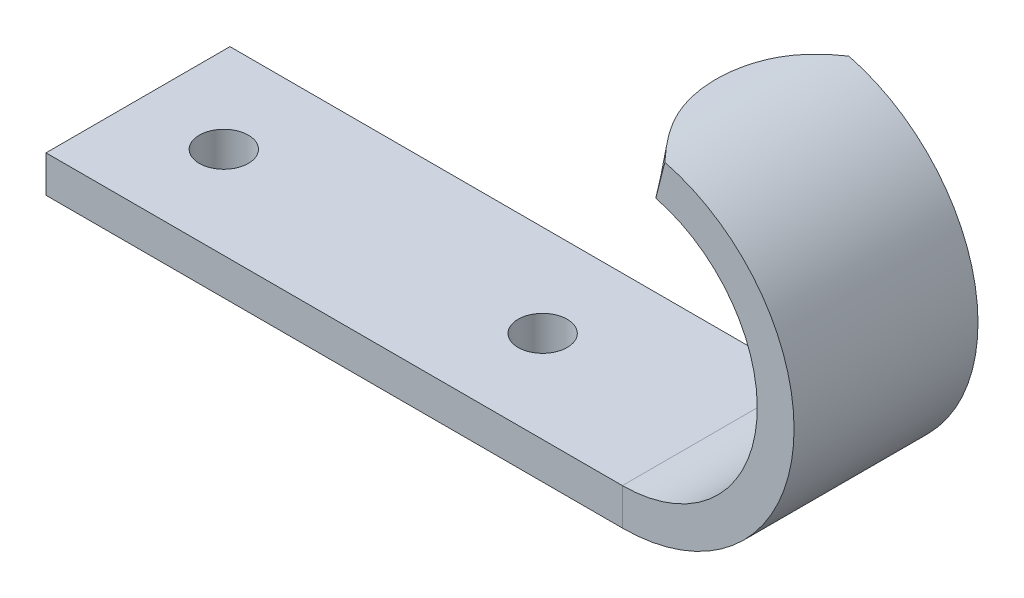
ISO-10303-21;
HEADER;
FILE_DESCRIPTION(('STEP AP214'),'2;1');
FILE_NAME('part.step','',(''),(''),'','','');
FILE_SCHEMA(('AUTOMOTIVE_DESIGN { 1 0 10303 214 1 1 1 1 }'));
ENDSEC;
DATA;
#1=APPLICATION_CONTEXT('core data for automotive mechanical design processes');
#2=APPLICATION_PROTOCOL_DEFINITION('international standard','automotive_design',2000,#1);
#3=PRODUCT_CONTEXT('',#1,'mechanical');
#4=PRODUCT('Part','Part','',(#3));
#5=PRODUCT_RELATED_PRODUCT_CATEGORY('part','',(#4));
#6=PRODUCT_DEFINITION_FORMATION('','',#4);
#7=PRODUCT_DEFINITION_CONTEXT('part definition',#1,'design');
#8=PRODUCT_DEFINITION('design','',#6,#7);
#9=PRODUCT_DEFINITION_SHAPE('','',#8);
#10=(LENGTH_UNIT() NAMED_UNIT(*) SI_UNIT(.MILLI.,.METRE.));
#11=(NAMED_UNIT(*) PLANE_ANGLE_UNIT() SI_UNIT($,.RADIAN.));
#12=(NAMED_UNIT(*) SI_UNIT($,.STERADIAN.) SOLID_ANGLE_UNIT());
#13=UNCERTAINTY_MEASURE_WITH_UNIT(LENGTH_MEASURE(1.E-05),#10,'distance_accuracy_value','');
#14=(GEOMETRIC_REPRESENTATION_CONTEXT(3) GLOBAL_UNCERTAINTY_ASSIGNED_CONTEXT((#13)) GLOBAL_UNIT_ASSIGNED_CONTEXT((#10,
#11,#12)) REPRESENTATION_CONTEXT('',''));
#15=CARTESIAN_POINT('',(0.,0.,0.));
#16=DIRECTION('',(0.,0.,1.));
#17=DIRECTION('',(1.,0.,0.));
#18=AXIS2_PLACEMENT_3D('',#15,#16,#17);
#19=CARTESIAN_POINT('',(-23.5,-3.,7.5));
#20=DIRECTION('',(-1.,0.,0.));
#21=DIRECTION('',(0.,0.,1.));
#22=AXIS2_PLACEMENT_3D('',#19,#20,#21);
#23=PLANE('',#22);
#24=DIRECTION('',(0.,1.,0.));
#25=VECTOR('',#24,1.);
#26=CARTESIAN_POINT('',(-23.5,-3.,-7.5));
#27=LINE('',#26,#25);
#28=CARTESIAN_POINT('',(-23.5,-3.,-7.5));
#29=VERTEX_POINT('',#28);
#30=CARTESIAN_POINT('',(-23.5,0.,-7.5));
#31=VERTEX_POINT('',#30);
#32=EDGE_CURVE('E374',#29,#31,#27,.T.);
#33=ORIENTED_EDGE('',*,*,#32,.F.);
#34=DIRECTION('',(0.,0.,-1.));
#35=VECTOR('',#34,1.);
#36=CARTESIAN_POINT('',(-23.5,-3.,7.5));
#37=LINE('',#36,#35);
#38=CARTESIAN_POINT('',(-23.5,-3.,7.5));
#39=VERTEX_POINT('',#38);
#40=EDGE_CURVE('E64',#39,#29,#37,.T.);
#41=ORIENTED_EDGE('',*,*,#40,.F.);
#42=DIRECTION('',(0.,1.,0.));
#43=VECTOR('',#42,1.);
#44=CARTESIAN_POINT('',(-23.5,-3.,7.5));
#45=LINE('',#44,#43);
#46=CARTESIAN_POINT('',(-23.5,0.,7.5));
#47=VERTEX_POINT('',#46);
#48=EDGE_CURVE('E128',#39,#47,#45,.T.);
#49=ORIENTED_EDGE('',*,*,#48,.T.);
#50=DIRECTION('',(0.,0.,-1.));
#51=VECTOR('',#50,1.);
#52=CARTESIAN_POINT('',(-23.5,0.,7.5));
#53=LINE('',#52,#51);
#54=EDGE_CURVE('E132',#47,#31,#53,.T.);
#55=ORIENTED_EDGE('',*,*,#54,.T.);
#56=EDGE_LOOP('',(#33,#41,#49,#55));
#57=FACE_BOUND('',#56,.T.);
#58=ADVANCED_FACE('F45',(#57),#23,.T.);
#59=CARTESIAN_POINT('',(-23.5,0.,7.5));
#60=DIRECTION('',(0.,1.,0.));
#61=DIRECTION('',(0.,0.,1.));
#62=AXIS2_PLACEMENT_3D('',#59,#60,#61);
#63=PLANE('',#62);
#64=CARTESIAN_POINT('',(-16.5,0.,0.));
#65=DIRECTION('',(0.,1.,0.));
#66=DIRECTION('',(0.,0.,1.));
#67=AXIS2_PLACEMENT_3D('',#64,#65,#66);
#68=CIRCLE('',#67,2.);
#69=CARTESIAN_POINT('',(-16.5,0.,2.));
#70=VERTEX_POINT('',#69);
#71=EDGE_CURVE('E224',#70,#70,#68,.T.);
#72=ORIENTED_EDGE('',*,*,#71,.F.);
#73=EDGE_LOOP('',(#72));
#74=FACE_BOUND('',#73,.T.);
#75=CARTESIAN_POINT('',(9.49999999999999,0.,0.));
#76=DIRECTION('',(0.,1.,0.));
#77=DIRECTION('',(0.,0.,1.));
#78=AXIS2_PLACEMENT_3D('',#75,#76,#77);
#79=CIRCLE('',#78,2.);
#80=CARTESIAN_POINT('',(9.49999999999999,0.,2.));
#81=VERTEX_POINT('',#80);
#82=EDGE_CURVE('E225',#81,#81,#79,.T.);
#83=ORIENTED_EDGE('',*,*,#82,.F.);
#84=EDGE_LOOP('',(#83));
#85=FACE_BOUND('',#84,.T.);
#86=DIRECTION('',(1.,0.,0.));
#87=VECTOR('',#86,1.);
#88=CARTESIAN_POINT('',(-23.5,0.,-7.5));
#89=LINE('',#88,#87);
#90=CARTESIAN_POINT('',(23.5,0.,-7.5));
#91=VERTEX_POINT('',#90);
#92=EDGE_CURVE('E369',#31,#91,#89,.T.);
#93=ORIENTED_EDGE('',*,*,#92,.F.);
#94=ORIENTED_EDGE('',*,*,#54,.F.);
#95=DIRECTION('',(1.,0.,0.));
#96=VECTOR('',#95,1.);
#97=CARTESIAN_POINT('',(-23.5,0.,7.5));
#98=LINE('',#97,#96);
#99=CARTESIAN_POINT('',(23.5,0.,7.5));
#100=VERTEX_POINT('',#99);
#101=EDGE_CURVE('E381',#47,#100,#98,.T.);
#102=ORIENTED_EDGE('',*,*,#101,.T.);
#103=DIRECTION('',(0.,0.,-1.));
#104=VECTOR('',#103,1.);
#105=CARTESIAN_POINT('',(23.5,0.,7.5));
#106=LINE('',#105,#104);
#107=EDGE_CURVE('E372',#100,#91,#106,.T.);
#108=ORIENTED_EDGE('',*,*,#107,.T.);
#109=EDGE_LOOP('',(#93,#94,#102,#108));
#110=FACE_BOUND('',#109,.T.);
#111=ADVANCED_FACE('F205',(#74,#85,#110),#63,.T.);
#112=CARTESIAN_POINT('',(23.5,11.,-7.5));
#113=DIRECTION('',(0.,0.,1.));
#114=DIRECTION('',(1.,0.,0.));
#115=AXIS2_PLACEMENT_3D('',#112,#113,#114);
#116=PLANE('',#115);
#117=ORIENTED_EDGE('',*,*,#92,.T.);
#118=DIRECTION('',(0.,-1.,0.));
#119=VECTOR('',#118,1.);
#120=CARTESIAN_POINT('',(23.5,0.,-7.5));
#121=LINE('',#120,#119);
#122=CARTESIAN_POINT('',(23.5,-3.,-7.5));
#123=VERTEX_POINT('',#122);
#124=EDGE_CURVE('E91',#91,#123,#121,.T.);
#125=ORIENTED_EDGE('',*,*,#124,.T.);
#126=DIRECTION('',(1.,0.,0.));
#127=VECTOR('',#126,1.);
#128=CARTESIAN_POINT('',(-23.5,-3.,-7.5));
#129=LINE('',#128,#127);
#130=EDGE_CURVE('E131',#29,#123,#129,.T.);
#131=ORIENTED_EDGE('',*,*,#130,.F.);
#132=ORIENTED_EDGE('',*,*,#32,.T.);
#133=EDGE_LOOP('',(#117,#125,#131,#132));
#134=FACE_BOUND('',#133,.T.);
#135=ADVANCED_FACE('F208',(#134),#116,.F.);
#136=CARTESIAN_POINT('',(-23.5,-3.,7.5));
#137=DIRECTION('',(0.,1.,0.));
#138=DIRECTION('',(0.,0.,1.));
#139=AXIS2_PLACEMENT_3D('',#136,#137,#138);
#140=PLANE('',#139);
#141=CARTESIAN_POINT('',(-16.5,-3.,0.));
#142=DIRECTION('',(0.,1.,0.));
#143=DIRECTION('',(0.,0.,1.));
#144=AXIS2_PLACEMENT_3D('',#141,#142,#143);
#145=CIRCLE('',#144,2.);
#146=CARTESIAN_POINT('',(-16.5,-3.,2.));
#147=VERTEX_POINT('',#146);
#148=EDGE_CURVE('E125',#147,#147,#145,.T.);
#149=ORIENTED_EDGE('',*,*,#148,.T.);
#150=EDGE_LOOP('',(#149));
#151=FACE_BOUND('',#150,.T.);
#152=CARTESIAN_POINT('',(9.49999999999999,-3.,0.));
#153=DIRECTION('',(0.,1.,0.));
#154=DIRECTION('',(0.,0.,1.));
#155=AXIS2_PLACEMENT_3D('',#152,#153,#154);
#156=CIRCLE('',#155,2.);
#157=CARTESIAN_POINT('',(9.49999999999999,-3.,2.));
#158=VERTEX_POINT('',#157);
#159=EDGE_CURVE('E222',#158,#158,#156,.T.);
#160=ORIENTED_EDGE('',*,*,#159,.T.);
#161=EDGE_LOOP('',(#160));
#162=FACE_BOUND('',#161,.T.);
#163=ORIENTED_EDGE('',*,*,#130,.T.);
#164=DIRECTION('',(0.,0.,-1.));
#165=VECTOR('',#164,1.);
#166=CARTESIAN_POINT('',(23.5,-3.,7.5));
#167=LINE('',#166,#165);
#168=CARTESIAN_POINT('',(23.5,-3.,7.5));
#169=VERTEX_POINT('',#168);
#170=EDGE_CURVE('E49',#169,#123,#167,.T.);
#171=ORIENTED_EDGE('',*,*,#170,.F.);
#172=DIRECTION('',(1.,0.,0.));
#173=VECTOR('',#172,1.);
#174=CARTESIAN_POINT('',(-23.5,-3.,7.5));
#175=LINE('',#174,#173);
#176=EDGE_CURVE('E55',#39,#169,#175,.T.);
#177=ORIENTED_EDGE('',*,*,#176,.F.);
#178=ORIENTED_EDGE('',*,*,#40,.T.);
#179=EDGE_LOOP('',(#163,#171,#177,#178));
#180=FACE_BOUND('',#179,.T.);
#181=ADVANCED_FACE('F130',(#151,#162,#180),#140,.F.);
#182=CARTESIAN_POINT('',(23.5,11.,7.5));
#183=DIRECTION('',(0.,0.,1.));
#184=DIRECTION('',(1.,0.,0.));
#185=AXIS2_PLACEMENT_3D('',#182,#183,#184);
#186=PLANE('',#185);
#187=ORIENTED_EDGE('',*,*,#176,.T.);
#188=DIRECTION('',(0.,1.,0.));
#189=VECTOR('',#188,1.);
#190=CARTESIAN_POINT('',(23.5,-3.,7.5));
#191=LINE('',#190,#189);
#192=EDGE_CURVE('E12',#169,#100,#191,.T.);
#193=ORIENTED_EDGE('',*,*,#192,.T.);
#194=ORIENTED_EDGE('',*,*,#101,.F.);
#195=ORIENTED_EDGE('',*,*,#48,.F.);
#196=EDGE_LOOP('',(#187,#193,#194,#195));
#197=FACE_BOUND('',#196,.T.);
#198=ADVANCED_FACE('F47',(#197),#186,.T.);
#199=CARTESIAN_POINT('',(23.5,11.,7.5));
#200=DIRECTION('',(0.,0.,-1.));
#201=DIRECTION('',(-1.,0.,0.));
#202=AXIS2_PLACEMENT_3D('',#199,#200,#201);
#203=PLANE('',#202);
#204=ORIENTED_EDGE('',*,*,#192,.F.);
#205=CARTESIAN_POINT('',(23.5,11.,7.5));
#206=DIRECTION('',(0.,0.,-1.));
#207=DIRECTION('',(-1.,0.,0.));
#208=AXIS2_PLACEMENT_3D('',#205,#206,#207);
#209=CIRCLE('',#208,14.);
#210=CARTESIAN_POINT('',(26.9664837057741,24.5640514123769,7.5));
#211=VERTEX_POINT('',#210);
#212=EDGE_CURVE('E115',#169,#211,#209,.F.);
#213=ORIENTED_EDGE('',*,*,#212,.T.);
#214=CARTESIAN_POINT('',(26.2236657688225,21.6574689668675,7.5));
#215=CARTESIAN_POINT('',(26.9664837057741,24.5640514123769,7.5));
#216=B_SPLINE_CURVE_WITH_KNOTS('',1,(#214,#215),.UNSPECIFIED.,.F.,.F.,(2,2),(0.,1.),.UNSPECIFIED.);
#217=CARTESIAN_POINT('',(26.2236657688225,21.6574689668675,7.5));
#218=VERTEX_POINT('',#217);
#219=EDGE_CURVE('E107',#211,#218,#216,.F.);
#220=ORIENTED_EDGE('',*,*,#219,.T.);
#221=CARTESIAN_POINT('',(23.5,11.,7.5));
#222=DIRECTION('',(0.,0.,1.));
#223=DIRECTION('',(1.,0.,0.));
#224=AXIS2_PLACEMENT_3D('',#221,#222,#223);
#225=CIRCLE('',#224,11.);
#226=EDGE_CURVE('E117',#100,#218,#225,.T.);
#227=ORIENTED_EDGE('',*,*,#226,.F.);
#228=EDGE_LOOP('',(#204,#213,#220,#227));
#229=FACE_BOUND('',#228,.T.);
#230=ADVANCED_FACE('F114',(#229),#203,.F.);
#231=CARTESIAN_POINT('',(26.9664837057741,24.5640514123769,7.5));
#232=CARTESIAN_POINT('',(26.4073700366894,24.706940757502,6.90538838460089));
#233=CARTESIAN_POINT('',(25.9141702009009,24.7968015168456,6.31030333278491));
#234=CARTESIAN_POINT('',(25.0744122754349,24.9176569810119,5.11872500459846));
#235=CARTESIAN_POINT('',(24.7277087885453,24.948705661154,4.52230862018143));
#236=CARTESIAN_POINT('',(24.3892510079016,24.9718945136525,3.77600411425541));
#237=CARTESIAN_POINT('',(24.3262902951495,24.9757161976618,3.62670401179997));
#238=CARTESIAN_POINT('',(24.238972010123,24.9805139422918,3.40269505621146));
#239=CARTESIAN_POINT('',(24.2110529332922,24.9819569429318,3.32801560403107));
#240=CARTESIAN_POINT('',(24.1575920436683,24.9845732481205,3.17863709903516));
#241=CARTESIAN_POINT('',(24.128598885025,24.9859068087157,3.09414112840128));
#242=CARTESIAN_POINT('',(23.9940180814194,24.9916960823411,2.68466532357509));
#243=CARTESIAN_POINT('',(23.9042419401255,24.9943471386923,2.35472859841088));
#244=CARTESIAN_POINT('',(23.6887326315238,24.9994654730574,1.35785017900856));
#245=CARTESIAN_POINT('',(23.6168232459546,24.9995125749462,0.680513719000054));
#246=CARTESIAN_POINT('',(23.6166574375609,24.9995139576035,-0.679701764000263));
#247=CARTESIAN_POINT('',(23.6884361380124,24.9994684992906,-1.35223354310125));
#248=CARTESIAN_POINT('',(23.9038041721979,24.9943595352092,-2.34966726815399));
#249=CARTESIAN_POINT('',(23.9935422521115,24.9917126501321,-2.68025118590511));
#250=CARTESIAN_POINT('',(24.1280868312385,24.9859297996175,-3.09111359484427));
#251=CARTESIAN_POINT('',(24.1561140717721,24.9846475016314,-3.17316770221962));
#252=CARTESIAN_POINT('',(24.1998302643823,24.9825051566617,-3.2960713016639));
#253=CARTESIAN_POINT('',(24.2146815456728,24.9817545335936,-3.3370095745422));
#254=CARTESIAN_POINT('',(24.2373769767511,24.9805698232048,-3.39837259345498));
#255=CARTESIAN_POINT('',(24.2456128401108,24.9801325411074,-3.42042005760482));
#256=CARTESIAN_POINT('',(24.2589163956283,24.9794166644647,-3.45569305298585));
#257=CARTESIAN_POINT('',(24.2656485822937,24.9790496387007,-3.47334203272117));
#258=CARTESIAN_POINT('',(24.3269617076141,24.9756614768339,-3.63229518874251));
#259=CARTESIAN_POINT('',(24.3866073364979,24.9720486154866,-3.77438573385196));
#260=CARTESIAN_POINT('',(24.710475266805,24.9499889229668,-4.48883271374049));
#261=CARTESIAN_POINT('',(25.0518780123122,24.9202160044472,-5.07317191154343));
#262=CARTESIAN_POINT('',(25.8936622602974,24.800402891191,-6.26741353493354));
#263=CARTESIAN_POINT('',(26.3942219816336,24.7103009275004,-6.87723081897154));
#264=CARTESIAN_POINT('',(26.9664837057741,24.5640514123769,-7.5));
#265=CARTESIAN_POINT('',(26.2236657688225,21.6574689668675,7.5));
#266=CARTESIAN_POINT('',(25.7843759169094,21.7697356538236,6.90540698920698));
#267=CARTESIAN_POINT('',(25.3968480149936,21.8403440489501,6.31030333278491));
#268=CARTESIAN_POINT('',(24.7370382164131,21.9353019136522,5.11872500459846));
#269=CARTESIAN_POINT('',(24.4646283338571,21.9596973051924,4.52230862018143));
#270=CARTESIAN_POINT('',(24.1986972204941,21.9779171178698,3.77600411425541));
#271=CARTESIAN_POINT('',(24.149228089046,21.9809198695915,3.62670401179997));
#272=CARTESIAN_POINT('',(24.0806208650966,21.9846895260864,3.40269505621146));
#273=CARTESIAN_POINT('',(24.0586844475867,21.9858233123036,3.32801560403107));
#274=CARTESIAN_POINT('',(24.0166794628823,21.9878789806661,3.17863709903516));
#275=CARTESIAN_POINT('',(23.9938991239482,21.9889267782766,3.09414112840128));
#276=CARTESIAN_POINT('',(23.8881570639724,21.993475493268,2.68466532357509));
#277=CARTESIAN_POINT('',(23.8176186672415,21.9955584661154,2.35472859841088));
#278=CARTESIAN_POINT('',(23.6482899247687,21.9995800145451,1.35785017900856));
#279=CARTESIAN_POINT('',(23.59178969325,21.9996170231721,0.680513719000054));
#280=CARTESIAN_POINT('',(23.5916594152264,21.9996181095456,-0.679701764000263));
#281=CARTESIAN_POINT('',(23.6480569655812,21.9995823922998,-1.35223354310125));
#282=CARTESIAN_POINT('',(23.8172747067269,21.9955682062358,-2.34966726815399));
#283=CARTESIAN_POINT('',(23.8877831980876,21.993488510818,-2.68025118590511));
#284=CARTESIAN_POINT('',(23.9934967959731,21.9889448425566,-3.09111359484427));
#285=CARTESIAN_POINT('',(24.0155181992495,21.9879373227104,-3.17316770221962));
#286=CARTESIAN_POINT('',(24.0498666363004,21.9862540516627,-3.2960713016639));
#287=CARTESIAN_POINT('',(24.0615355001715,21.985664276395,-3.3370095745422));
#288=CARTESIAN_POINT('',(24.0793676245902,21.9847334325181,-3.39837259345498));
#289=CARTESIAN_POINT('',(24.0858386600871,21.9843898537272,-3.42042005760482));
#290=CARTESIAN_POINT('',(24.096291453708,21.9838273792223,-3.45569305298585));
#291=CARTESIAN_POINT('',(24.101581028945,21.9835390018363,-3.47334203272117));
#292=CARTESIAN_POINT('',(24.1497556274111,21.9808768746552,-3.63229518874251));
#293=CARTESIAN_POINT('',(24.1966200501055,21.9780381978823,-3.77438573385196));
#294=CARTESIAN_POINT('',(24.4510877096325,21.960705582331,-4.48883271374049));
#295=CARTESIAN_POINT('',(24.7193327239596,21.9373125749228,-5.07317191154343));
#296=CARTESIAN_POINT('',(25.3807346330908,21.8431737002215,-6.26741353493354));
#297=CARTESIAN_POINT('',(25.7740466807586,21.7723754350896,-6.87725176624796));
#298=CARTESIAN_POINT('',(26.2236657688225,21.6574689668675,-7.5));
#299=B_SPLINE_SURFACE_WITH_KNOTS('',1,3,((#231,#232,#233,#234,#235,#236,#237,#238,#239,#240,
#241,#242,#243,#244,#245,#246,#247,#248,#249,#250,#251,#252,#253,#254,#255,#256,#257,#258,#259,
#260,#261,#262,#263,#264),(#265,#266,#267,#268,#269,#270,#271,#272,#273,#274,#275,#276,#277,
#278,#279,#280,#281,#282,#283,#284,#285,#286,#287,#288,#289,#290,#291,#292,#293,#294,#295,#296,
#297,#298)),.UNSPECIFIED.,.F.,.F.,.F.,(2,2),(4,2,2,2,2,2,2,2,2,2,2,2,2,2,2,2,4),(0.,1.),(0.,
0.125,0.25,0.28125,0.296875,0.3125,0.375,0.5,0.625,0.6875,0.703125,0.7109375,0.71484375,0.71875,
0.75,0.875,1.),.UNSPECIFIED.);
#300=CARTESIAN_POINT('',(26.9664837057741,24.5640514123769,7.5));
#301=CARTESIAN_POINT('',(26.4073700366894,24.706940757502,6.90538838460089));
#302=CARTESIAN_POINT('',(25.9141702009009,24.7968015168456,6.31030333278491));
#303=CARTESIAN_POINT('',(25.0744122754349,24.9176569810119,5.11872500459846));
#304=CARTESIAN_POINT('',(24.7277087885453,24.948705661154,4.52230862018143));
#305=CARTESIAN_POINT('',(24.3892510079016,24.9718945136525,3.77600411425541));
#306=CARTESIAN_POINT('',(24.3262902951495,24.9757161976618,3.62670401179997));
#307=CARTESIAN_POINT('',(24.238972010123,24.9805139422918,3.40269505621146));
#308=CARTESIAN_POINT('',(24.2110529332922,24.9819569429318,3.32801560403107));
#309=CARTESIAN_POINT('',(24.1575920436683,24.9845732481205,3.17863709903516));
#310=CARTESIAN_POINT('',(24.128598885025,24.9859068087157,3.09414112840128));
#311=CARTESIAN_POINT('',(23.9940180814194,24.9916960823411,2.68466532357509));
#312=CARTESIAN_POINT('',(23.9042419401255,24.9943471386923,2.35472859841088));
#313=CARTESIAN_POINT('',(23.6887326315238,24.9994654730574,1.35785017900856));
#314=CARTESIAN_POINT('',(23.6168232459546,24.9995125749462,0.680513719000054));
#315=CARTESIAN_POINT('',(23.6166574375609,24.9995139576035,-0.679701764000263));
#316=CARTESIAN_POINT('',(23.6884361380124,24.9994684992906,-1.35223354310125));
#317=CARTESIAN_POINT('',(23.9038041721979,24.9943595352092,-2.34966726815399));
#318=CARTESIAN_POINT('',(23.9935422521115,24.9917126501321,-2.68025118590511));
#319=CARTESIAN_POINT('',(24.1280868312385,24.9859297996175,-3.09111359484427));
#320=CARTESIAN_POINT('',(24.1561140717721,24.9846475016314,-3.17316770221962));
#321=CARTESIAN_POINT('',(24.1998302643823,24.9825051566617,-3.2960713016639));
#322=CARTESIAN_POINT('',(24.2146815456728,24.9817545335936,-3.3370095745422));
#323=CARTESIAN_POINT('',(24.2373769767511,24.9805698232048,-3.39837259345498));
#324=CARTESIAN_POINT('',(24.2456128401108,24.9801325411074,-3.42042005760482));
#325=CARTESIAN_POINT('',(24.2589163956283,24.9794166644647,-3.45569305298585));
#326=CARTESIAN_POINT('',(24.2656485822937,24.9790496387007,-3.47334203272117));
#327=CARTESIAN_POINT('',(24.3269617076141,24.9756614768339,-3.63229518874251));
#328=CARTESIAN_POINT('',(24.3866073364979,24.9720486154866,-3.77438573385196));
#329=CARTESIAN_POINT('',(24.710475266805,24.9499889229668,-4.48883271374049));
#330=CARTESIAN_POINT('',(25.0518780123122,24.9202160044472,-5.07317191154343));
#331=CARTESIAN_POINT('',(25.8936622602974,24.800402891191,-6.26741353493354));
#332=CARTESIAN_POINT('',(26.3942219816336,24.7103009275004,-6.87723081897154));
#333=CARTESIAN_POINT('',(26.9664837057741,24.5640514123769,-7.5));
#334=B_SPLINE_CURVE_WITH_KNOTS('',3,(#300,#301,#302,#303,#304,#305,#306,#307,#308,#309,#310,
#311,#312,#313,#314,#315,#316,#317,#318,#319,#320,#321,#322,#323,#324,#325,#326,#327,#328,#329,
#330,#331,#332,#333),.UNSPECIFIED.,.F.,.F.,(4,2,2,2,2,2,2,2,2,2,2,2,2,2,2,2,4),(0.,0.125,0.25,
0.28125,0.296875,0.3125,0.375,0.5,0.625,0.6875,0.703125,0.7109375,0.71484375,0.71875,0.75,0.875,
1.),.UNSPECIFIED.);
#335=CARTESIAN_POINT('',(26.9664837057741,24.5640514123769,-7.5));
#336=VERTEX_POINT('',#335);
#337=EDGE_CURVE('E123',#211,#336,#334,.T.);
#338=CARTESIAN_POINT('',(26.9664837057741,24.5640514123769,-7.5));
#339=CARTESIAN_POINT('',(26.2236657688225,21.6574689668675,-7.5));
#340=B_SPLINE_CURVE_WITH_KNOTS('',1,(#338,#339),.UNSPECIFIED.,.F.,.F.,(2,2),(0.,1.),.UNSPECIFIED.);
#341=CARTESIAN_POINT('',(26.2236657688225,21.6574689668675,-7.5));
#342=VERTEX_POINT('',#341);
#343=EDGE_CURVE('E133',#336,#342,#340,.T.);
#344=CARTESIAN_POINT('',(26.2236657688225,21.6574689668675,-7.5));
#345=CARTESIAN_POINT('',(25.7740466807586,21.7723754350896,-6.87725176624796));
#346=CARTESIAN_POINT('',(25.3807346330908,21.8431737002215,-6.26741353493354));
#347=CARTESIAN_POINT('',(24.7193327239596,21.9373125749228,-5.07317191154343));
#348=CARTESIAN_POINT('',(24.4510877096325,21.960705582331,-4.48883271374049));
#349=CARTESIAN_POINT('',(24.1966200501055,21.9780381978823,-3.77438573385196));
#350=CARTESIAN_POINT('',(24.1497556274111,21.9808768746552,-3.63229518874251));
#351=CARTESIAN_POINT('',(24.101581028945,21.9835390018363,-3.47334203272117));
#352=CARTESIAN_POINT('',(24.096291453708,21.9838273792223,-3.45569305298585));
#353=CARTESIAN_POINT('',(24.0858386600871,21.9843898537272,-3.42042005760482));
#354=CARTESIAN_POINT('',(24.0793676245902,21.9847334325181,-3.39837259345498));
#355=CARTESIAN_POINT('',(24.0615355001715,21.985664276395,-3.3370095745422));
#356=CARTESIAN_POINT('',(24.0498666363004,21.9862540516627,-3.2960713016639));
#357=CARTESIAN_POINT('',(24.0155181992495,21.9879373227104,-3.17316770221962));
#358=CARTESIAN_POINT('',(23.9934967959731,21.9889448425566,-3.09111359484427));
#359=CARTESIAN_POINT('',(23.8877831980876,21.993488510818,-2.68025118590511));
#360=CARTESIAN_POINT('',(23.8172747067269,21.9955682062358,-2.34966726815399));
#361=CARTESIAN_POINT('',(23.6480569655812,21.9995823922998,-1.35223354310125));
#362=CARTESIAN_POINT('',(23.5916594152264,21.9996181095456,-0.679701764000263));
#363=CARTESIAN_POINT('',(23.59178969325,21.9996170231721,0.680513719000054));
#364=CARTESIAN_POINT('',(23.6482899247687,21.9995800145451,1.35785017900856));
#365=CARTESIAN_POINT('',(23.8176186672415,21.9955584661154,2.35472859841088));
#366=CARTESIAN_POINT('',(23.8881570639724,21.993475493268,2.68466532357509));
#367=CARTESIAN_POINT('',(23.9938991239482,21.9889267782766,3.09414112840128));
#368=CARTESIAN_POINT('',(24.0166794628823,21.9878789806661,3.17863709903516));
#369=CARTESIAN_POINT('',(24.0586844475867,21.9858233123036,3.32801560403107));
#370=CARTESIAN_POINT('',(24.0806208650966,21.9846895260864,3.40269505621146));
#371=CARTESIAN_POINT('',(24.149228089046,21.9809198695915,3.62670401179997));
#372=CARTESIAN_POINT('',(24.1986972204941,21.9779171178698,3.77600411425541));
#373=CARTESIAN_POINT('',(24.4646283338571,21.9596973051924,4.52230862018143));
#374=CARTESIAN_POINT('',(24.7370382164131,21.9353019136522,5.11872500459846));
#375=CARTESIAN_POINT('',(25.3968480149936,21.8403440489501,6.31030333278491));
#376=CARTESIAN_POINT('',(25.7843759169094,21.7697356538236,6.90540698920698));
#377=CARTESIAN_POINT('',(26.2236657688225,21.6574689668675,7.5));
#378=B_SPLINE_CURVE_WITH_KNOTS('',3,(#344,#345,#346,#347,#348,#349,#350,#351,#352,#353,#354,
#355,#356,#357,#358,#359,#360,#361,#362,#363,#364,#365,#366,#367,#368,#369,#370,#371,#372,#373,
#374,#375,#376,#377),.UNSPECIFIED.,.F.,.F.,(4,2,2,2,2,2,2,2,2,2,2,2,2,2,2,2,4),(0.,0.125,0.25,
0.28125,0.28515625,0.2890625,0.296875,0.3125,0.375,0.5,0.625,0.6875,0.703125,0.71875,0.75,0.875,
1.),.UNSPECIFIED.);
#379=EDGE_CURVE('E138',#218,#342,#378,.F.);
#380=ORIENTED_EDGE('',*,*,#219,.F.);
#381=ORIENTED_EDGE('',*,*,#337,.T.);
#382=ORIENTED_EDGE('',*,*,#343,.T.);
#383=ORIENTED_EDGE('',*,*,#379,.F.);
#384=EDGE_LOOP('',(#380,#381,#382,#383));
#385=FACE_BOUND('',#384,.T.);
#386=ADVANCED_FACE('F176',(#385),#299,.F.);
#387=CARTESIAN_POINT('',(23.5,11.,-7.5));
#388=DIRECTION('',(0.,0.,1.));
#389=DIRECTION('',(1.,0.,0.));
#390=AXIS2_PLACEMENT_3D('',#387,#388,#389);
#391=PLANE('',#390);
#392=ORIENTED_EDGE('',*,*,#343,.F.);
#393=CARTESIAN_POINT('',(23.5,11.,-7.5));
#394=DIRECTION('',(0.,0.,-1.));
#395=DIRECTION('',(-1.,0.,0.));
#396=AXIS2_PLACEMENT_3D('',#393,#394,#395);
#397=CIRCLE('',#396,14.);
#398=EDGE_CURVE('E153',#336,#123,#397,.T.);
#399=ORIENTED_EDGE('',*,*,#398,.T.);
#400=ORIENTED_EDGE('',*,*,#124,.F.);
#401=CARTESIAN_POINT('',(23.5,11.,-7.5));
#402=DIRECTION('',(0.,0.,-1.));
#403=DIRECTION('',(-1.,0.,0.));
#404=AXIS2_PLACEMENT_3D('',#401,#402,#403);
#405=CIRCLE('',#404,11.);
#406=EDGE_CURVE('E135',#342,#91,#405,.T.);
#407=ORIENTED_EDGE('',*,*,#406,.F.);
#408=EDGE_LOOP('',(#392,#399,#400,#407));
#409=FACE_BOUND('',#408,.T.);
#410=ADVANCED_FACE('F172',(#409),#391,.F.);
#411=CARTESIAN_POINT('',(23.5,11.,40.5626894630736));
#412=DIRECTION('',(0.,0.,-1.));
#413=DIRECTION('',(-1.,0.,0.));
#414=AXIS2_PLACEMENT_3D('',#411,#412,#413);
#415=CYLINDRICAL_SURFACE('',#414,11.);
#416=ORIENTED_EDGE('',*,*,#406,.T.);
#417=ORIENTED_EDGE('',*,*,#107,.F.);
#418=ORIENTED_EDGE('',*,*,#226,.T.);
#419=ORIENTED_EDGE('',*,*,#379,.T.);
#420=EDGE_LOOP('',(#416,#417,#418,#419));
#421=FACE_BOUND('',#420,.T.);
#422=ADVANCED_FACE('F169',(#421),#415,.F.);
#423=CARTESIAN_POINT('',(23.5,11.,40.5626894630736));
#424=DIRECTION('',(0.,0.,-1.));
#425=DIRECTION('',(-1.,0.,0.));
#426=AXIS2_PLACEMENT_3D('',#423,#424,#425);
#427=CYLINDRICAL_SURFACE('',#426,14.);
#428=ORIENTED_EDGE('',*,*,#398,.F.);
#429=ORIENTED_EDGE('',*,*,#337,.F.);
#430=ORIENTED_EDGE('',*,*,#212,.F.);
#431=ORIENTED_EDGE('',*,*,#170,.T.);
#432=EDGE_LOOP('',(#428,#429,#430,#431));
#433=FACE_BOUND('',#432,.T.);
#434=ADVANCED_FACE('F122',(#433),#427,.T.);
#435=CARTESIAN_POINT('',(9.49999999999999,-3.,0.));
#436=DIRECTION('',(0.,1.,0.));
#437=DIRECTION('',(0.,0.,1.));
#438=AXIS2_PLACEMENT_3D('',#435,#436,#437);
#439=CYLINDRICAL_SURFACE('',#438,2.);
#440=ORIENTED_EDGE('',*,*,#159,.F.);
#441=EDGE_LOOP('',(#440));
#442=FACE_BOUND('',#441,.T.);
#443=ORIENTED_EDGE('',*,*,#82,.T.);
#444=EDGE_LOOP('',(#443));
#445=FACE_BOUND('',#444,.T.);
#446=ADVANCED_FACE('F168',(#442,#445),#439,.F.);
#447=CARTESIAN_POINT('',(-16.5,-3.,0.));
#448=DIRECTION('',(0.,1.,0.));
#449=DIRECTION('',(0.,0.,1.));
#450=AXIS2_PLACEMENT_3D('',#447,#448,#449);
#451=CYLINDRICAL_SURFACE('',#450,2.);
#452=ORIENTED_EDGE('',*,*,#148,.F.);
#453=EDGE_LOOP('',(#452));
#454=FACE_BOUND('',#453,.T.);
#455=ORIENTED_EDGE('',*,*,#71,.T.);
#456=EDGE_LOOP('',(#455));
#457=FACE_BOUND('',#456,.T.);
#458=ADVANCED_FACE('F286',(#454,#457),#451,.F.);
#459=CLOSED_SHELL('',(#58,#111,#135,#181,#198,#230,#386,#410,#422,#434,#446,#458));
#460=MANIFOLD_SOLID_BREP('B2',#459);
#461=ADVANCED_BREP_SHAPE_REPRESENTATION('',(#18,#460),#14);
#462=SHAPE_DEFINITION_REPRESENTATION(#9,#461);
ENDSEC;
END-ISO-10303-21;
